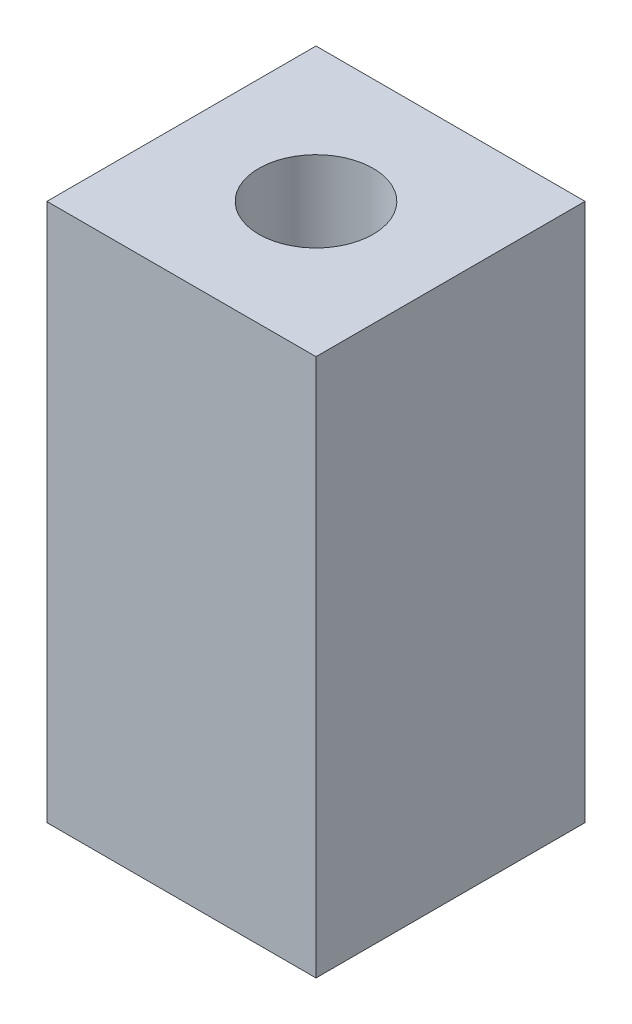
ISO-10303-21;
HEADER;
FILE_DESCRIPTION(('STEP AP214'),'2;1');
FILE_NAME('part.step','',(''),(''),'','','');
FILE_SCHEMA(('AUTOMOTIVE_DESIGN { 1 0 10303 214 1 1 1 1 }'));
ENDSEC;
DATA;
#1=APPLICATION_CONTEXT('core data for automotive mechanical design processes');
#2=APPLICATION_PROTOCOL_DEFINITION('international standard','automotive_design',2000,#1);
#3=PRODUCT_CONTEXT('',#1,'mechanical');
#4=PRODUCT('Part','Part','',(#3));
#5=PRODUCT_RELATED_PRODUCT_CATEGORY('part','',(#4));
#6=PRODUCT_DEFINITION_FORMATION('','',#4);
#7=PRODUCT_DEFINITION_CONTEXT('part definition',#1,'design');
#8=PRODUCT_DEFINITION('design','',#6,#7);
#9=PRODUCT_DEFINITION_SHAPE('','',#8);
#10=(LENGTH_UNIT() NAMED_UNIT(*) SI_UNIT(.MILLI.,.METRE.));
#11=(NAMED_UNIT(*) PLANE_ANGLE_UNIT() SI_UNIT($,.RADIAN.));
#12=(NAMED_UNIT(*) SI_UNIT($,.STERADIAN.) SOLID_ANGLE_UNIT());
#13=UNCERTAINTY_MEASURE_WITH_UNIT(LENGTH_MEASURE(1.E-05),#10,'distance_accuracy_value','');
#14=(GEOMETRIC_REPRESENTATION_CONTEXT(3) GLOBAL_UNCERTAINTY_ASSIGNED_CONTEXT((#13)) GLOBAL_UNIT_ASSIGNED_CONTEXT((#10,
#11,#12)) REPRESENTATION_CONTEXT('',''));
#15=CARTESIAN_POINT('',(0.,0.,0.));
#16=DIRECTION('',(0.,0.,1.));
#17=DIRECTION('',(1.,0.,0.));
#18=AXIS2_PLACEMENT_3D('',#15,#16,#17);
#19=CARTESIAN_POINT('',(0.,31.75,0.));
#20=DIRECTION('',(0.,-1.,0.));
#21=DIRECTION('',(0.,0.,-1.));
#22=AXIS2_PLACEMENT_3D('',#19,#20,#21);
#23=PLANE('',#22);
#24=DIRECTION('',(0.,0.,-1.));
#25=VECTOR('',#24,1.);
#26=CARTESIAN_POINT('',(7.9375,31.75,7.9375));
#27=LINE('',#26,#25);
#28=CARTESIAN_POINT('',(7.9375,31.75,7.9375));
#29=VERTEX_POINT('',#28);
#30=CARTESIAN_POINT('',(7.9375,31.75,-7.9375));
#31=VERTEX_POINT('',#30);
#32=EDGE_CURVE('E84',#29,#31,#27,.T.);
#33=ORIENTED_EDGE('',*,*,#32,.T.);
#34=DIRECTION('',(-1.,0.,0.));
#35=VECTOR('',#34,1.);
#36=CARTESIAN_POINT('',(-7.9375,31.75,-7.9375));
#37=LINE('',#36,#35);
#38=CARTESIAN_POINT('',(-7.9375,31.75,-7.9375));
#39=VERTEX_POINT('',#38);
#40=EDGE_CURVE('E79',#31,#39,#37,.T.);
#41=ORIENTED_EDGE('',*,*,#40,.T.);
#42=DIRECTION('',(0.,0.,1.));
#43=VECTOR('',#42,1.);
#44=CARTESIAN_POINT('',(-7.9375,31.75,7.9375));
#45=LINE('',#44,#43);
#46=CARTESIAN_POINT('',(-7.9375,31.75,7.9375));
#47=VERTEX_POINT('',#46);
#48=EDGE_CURVE('E82',#39,#47,#45,.T.);
#49=ORIENTED_EDGE('',*,*,#48,.T.);
#50=DIRECTION('',(1.,0.,0.));
#51=VECTOR('',#50,1.);
#52=CARTESIAN_POINT('',(-7.9375,31.75,7.9375));
#53=LINE('',#52,#51);
#54=EDGE_CURVE('E49',#47,#29,#53,.T.);
#55=ORIENTED_EDGE('',*,*,#54,.T.);
#56=EDGE_LOOP('',(#33,#41,#49,#55));
#57=FACE_BOUND('',#56,.T.);
#58=CARTESIAN_POINT('',(0.,31.75,0.));
#59=DIRECTION('',(0.,1.,0.));
#60=DIRECTION('',(0.,0.,1.));
#61=AXIS2_PLACEMENT_3D('',#58,#59,#60);
#62=CIRCLE('',#61,3.3734375);
#63=CARTESIAN_POINT('',(0.,31.75,3.3734375));
#64=VERTEX_POINT('',#63);
#65=EDGE_CURVE('E99',#64,#64,#62,.T.);
#66=ORIENTED_EDGE('',*,*,#65,.F.);
#67=EDGE_LOOP('',(#66));
#68=FACE_BOUND('',#67,.T.);
#69=ADVANCED_FACE('F32',(#57,#68),#23,.F.);
#70=CARTESIAN_POINT('',(0.,0.,0.));
#71=DIRECTION('',(0.,-1.,0.));
#72=DIRECTION('',(0.,0.,-1.));
#73=AXIS2_PLACEMENT_3D('',#70,#71,#72);
#74=PLANE('',#73);
#75=DIRECTION('',(0.,0.,-1.));
#76=VECTOR('',#75,1.);
#77=CARTESIAN_POINT('',(7.9375,0.,7.9375));
#78=LINE('',#77,#76);
#79=CARTESIAN_POINT('',(7.9375,0.,7.9375));
#80=VERTEX_POINT('',#79);
#81=CARTESIAN_POINT('',(7.9375,0.,-7.9375));
#82=VERTEX_POINT('',#81);
#83=EDGE_CURVE('E96',#80,#82,#78,.T.);
#84=ORIENTED_EDGE('',*,*,#83,.F.);
#85=DIRECTION('',(1.,0.,0.));
#86=VECTOR('',#85,1.);
#87=CARTESIAN_POINT('',(-7.9375,0.,7.9375));
#88=LINE('',#87,#86);
#89=CARTESIAN_POINT('',(-7.9375,0.,7.9375));
#90=VERTEX_POINT('',#89);
#91=EDGE_CURVE('E72',#90,#80,#88,.T.);
#92=ORIENTED_EDGE('',*,*,#91,.F.);
#93=DIRECTION('',(0.,0.,1.));
#94=VECTOR('',#93,1.);
#95=CARTESIAN_POINT('',(-7.9375,0.,7.9375));
#96=LINE('',#95,#94);
#97=CARTESIAN_POINT('',(-7.9375,0.,-7.9375));
#98=VERTEX_POINT('',#97);
#99=EDGE_CURVE('E66',#98,#90,#96,.T.);
#100=ORIENTED_EDGE('',*,*,#99,.F.);
#101=DIRECTION('',(-1.,0.,0.));
#102=VECTOR('',#101,1.);
#103=CARTESIAN_POINT('',(-7.9375,0.,-7.9375));
#104=LINE('',#103,#102);
#105=EDGE_CURVE('E88',#82,#98,#104,.T.);
#106=ORIENTED_EDGE('',*,*,#105,.F.);
#107=EDGE_LOOP('',(#84,#92,#100,#106));
#108=FACE_BOUND('',#107,.T.);
#109=CARTESIAN_POINT('',(0.,0.,0.));
#110=DIRECTION('',(0.,1.,0.));
#111=DIRECTION('',(0.,0.,1.));
#112=AXIS2_PLACEMENT_3D('',#109,#110,#111);
#113=CIRCLE('',#112,3.3734375);
#114=CARTESIAN_POINT('',(0.,0.,3.3734375));
#115=VERTEX_POINT('',#114);
#116=EDGE_CURVE('E111',#115,#115,#113,.T.);
#117=ORIENTED_EDGE('',*,*,#116,.T.);
#118=EDGE_LOOP('',(#117));
#119=FACE_BOUND('',#118,.T.);
#120=ADVANCED_FACE('F107',(#108,#119),#74,.T.);
#121=CARTESIAN_POINT('',(7.9375,31.75,7.9375));
#122=DIRECTION('',(-1.,0.,0.));
#123=DIRECTION('',(0.,0.,1.));
#124=AXIS2_PLACEMENT_3D('',#121,#122,#123);
#125=PLANE('',#124);
#126=ORIENTED_EDGE('',*,*,#83,.T.);
#127=DIRECTION('',(0.,-1.,0.));
#128=VECTOR('',#127,1.);
#129=CARTESIAN_POINT('',(7.9375,31.75,-7.9375));
#130=LINE('',#129,#128);
#131=EDGE_CURVE('E11',#31,#82,#130,.T.);
#132=ORIENTED_EDGE('',*,*,#131,.F.);
#133=ORIENTED_EDGE('',*,*,#32,.F.);
#134=DIRECTION('',(0.,-1.,0.));
#135=VECTOR('',#134,1.);
#136=CARTESIAN_POINT('',(7.9375,31.75,7.9375));
#137=LINE('',#136,#135);
#138=EDGE_CURVE('E92',#29,#80,#137,.T.);
#139=ORIENTED_EDGE('',*,*,#138,.T.);
#140=EDGE_LOOP('',(#126,#132,#133,#139));
#141=FACE_BOUND('',#140,.T.);
#142=ADVANCED_FACE('F34',(#141),#125,.F.);
#143=CARTESIAN_POINT('',(-7.9375,31.75,-7.9375));
#144=DIRECTION('',(0.,0.,1.));
#145=DIRECTION('',(1.,0.,0.));
#146=AXIS2_PLACEMENT_3D('',#143,#144,#145);
#147=PLANE('',#146);
#148=ORIENTED_EDGE('',*,*,#105,.T.);
#149=DIRECTION('',(0.,-1.,0.));
#150=VECTOR('',#149,1.);
#151=CARTESIAN_POINT('',(-7.9375,31.75,-7.9375));
#152=LINE('',#151,#150);
#153=EDGE_CURVE('E41',#39,#98,#152,.T.);
#154=ORIENTED_EDGE('',*,*,#153,.F.);
#155=ORIENTED_EDGE('',*,*,#40,.F.);
#156=ORIENTED_EDGE('',*,*,#131,.T.);
#157=EDGE_LOOP('',(#148,#154,#155,#156));
#158=FACE_BOUND('',#157,.T.);
#159=ADVANCED_FACE('F87',(#158),#147,.F.);
#160=CARTESIAN_POINT('',(-7.9375,31.75,7.9375));
#161=DIRECTION('',(1.,0.,0.));
#162=DIRECTION('',(0.,0.,-1.));
#163=AXIS2_PLACEMENT_3D('',#160,#161,#162);
#164=PLANE('',#163);
#165=ORIENTED_EDGE('',*,*,#99,.T.);
#166=DIRECTION('',(0.,-1.,0.));
#167=VECTOR('',#166,1.);
#168=CARTESIAN_POINT('',(-7.9375,31.75,7.9375));
#169=LINE('',#168,#167);
#170=EDGE_CURVE('E89',#47,#90,#169,.T.);
#171=ORIENTED_EDGE('',*,*,#170,.F.);
#172=ORIENTED_EDGE('',*,*,#48,.F.);
#173=ORIENTED_EDGE('',*,*,#153,.T.);
#174=EDGE_LOOP('',(#165,#171,#172,#173));
#175=FACE_BOUND('',#174,.T.);
#176=ADVANCED_FACE('F90',(#175),#164,.F.);
#177=CARTESIAN_POINT('',(-7.9375,31.75,7.9375));
#178=DIRECTION('',(0.,0.,-1.));
#179=DIRECTION('',(-1.,0.,0.));
#180=AXIS2_PLACEMENT_3D('',#177,#178,#179);
#181=PLANE('',#180);
#182=ORIENTED_EDGE('',*,*,#91,.T.);
#183=ORIENTED_EDGE('',*,*,#138,.F.);
#184=ORIENTED_EDGE('',*,*,#54,.F.);
#185=ORIENTED_EDGE('',*,*,#170,.T.);
#186=EDGE_LOOP('',(#182,#183,#184,#185));
#187=FACE_BOUND('',#186,.T.);
#188=ADVANCED_FACE('F104',(#187),#181,.F.);
#189=CARTESIAN_POINT('',(0.,31.75,0.));
#190=DIRECTION('',(0.,-1.,0.));
#191=DIRECTION('',(0.,0.,-1.));
#192=AXIS2_PLACEMENT_3D('',#189,#190,#191);
#193=CYLINDRICAL_SURFACE('',#192,3.3734375);
#194=ORIENTED_EDGE('',*,*,#65,.T.);
#195=EDGE_LOOP('',(#194));
#196=FACE_BOUND('',#195,.T.);
#197=ORIENTED_EDGE('',*,*,#116,.F.);
#198=EDGE_LOOP('',(#197));
#199=FACE_BOUND('',#198,.T.);
#200=ADVANCED_FACE('F117',(#196,#199),#193,.F.);
#201=CLOSED_SHELL('',(#69,#120,#142,#159,#176,#188,#200));
#202=MANIFOLD_SOLID_BREP('B2',#201);
#203=ADVANCED_BREP_SHAPE_REPRESENTATION('',(#18,#202),#14);
#204=SHAPE_DEFINITION_REPRESENTATION(#9,#203);
ENDSEC;
END-ISO-10303-21;
